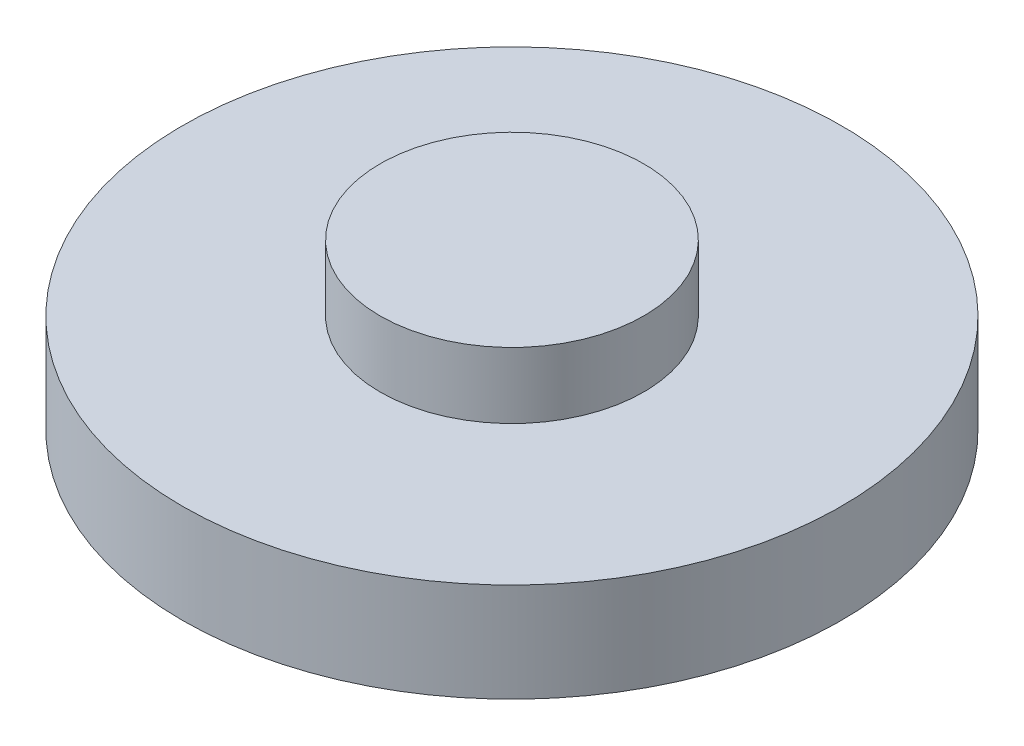
ISO-10303-21;
HEADER;
FILE_DESCRIPTION(('STEP AP214'),'2;1');
FILE_NAME('part.step','',(''),(''),'','','');
FILE_SCHEMA(('AUTOMOTIVE_DESIGN { 1 0 10303 214 1 1 1 1 }'));
ENDSEC;
DATA;
#1=APPLICATION_CONTEXT('core data for automotive mechanical design processes');
#2=APPLICATION_PROTOCOL_DEFINITION('international standard','automotive_design',2000,#1);
#3=PRODUCT_CONTEXT('',#1,'mechanical');
#4=PRODUCT('Part','Part','',(#3));
#5=PRODUCT_RELATED_PRODUCT_CATEGORY('part','',(#4));
#6=PRODUCT_DEFINITION_FORMATION('','',#4);
#7=PRODUCT_DEFINITION_CONTEXT('part definition',#1,'design');
#8=PRODUCT_DEFINITION('design','',#6,#7);
#9=PRODUCT_DEFINITION_SHAPE('','',#8);
#10=(LENGTH_UNIT() NAMED_UNIT(*) SI_UNIT(.MILLI.,.METRE.));
#11=(NAMED_UNIT(*) PLANE_ANGLE_UNIT() SI_UNIT($,.RADIAN.));
#12=(NAMED_UNIT(*) SI_UNIT($,.STERADIAN.) SOLID_ANGLE_UNIT());
#13=UNCERTAINTY_MEASURE_WITH_UNIT(LENGTH_MEASURE(1.E-05),#10,'distance_accuracy_value','');
#14=(GEOMETRIC_REPRESENTATION_CONTEXT(3) GLOBAL_UNCERTAINTY_ASSIGNED_CONTEXT((#13)) GLOBAL_UNIT_ASSIGNED_CONTEXT((#10,
#11,#12)) REPRESENTATION_CONTEXT('',''));
#15=CARTESIAN_POINT('',(0.,0.,0.));
#16=DIRECTION('',(0.,0.,1.));
#17=DIRECTION('',(1.,0.,0.));
#18=AXIS2_PLACEMENT_3D('',#15,#16,#17);
#19=CARTESIAN_POINT('',(0.,15.,0.));
#20=DIRECTION('',(0.,-1.,0.));
#21=DIRECTION('',(0.,0.,-1.));
#22=AXIS2_PLACEMENT_3D('',#19,#20,#21);
#23=CYLINDRICAL_SURFACE('',#22,50.);
#24=CARTESIAN_POINT('',(0.,15.,0.));
#25=DIRECTION('',(0.,1.,0.));
#26=DIRECTION('',(0.,0.,1.));
#27=AXIS2_PLACEMENT_3D('',#24,#25,#26);
#28=CIRCLE('',#27,50.);
#29=CARTESIAN_POINT('',(0.,15.,50.));
#30=VERTEX_POINT('',#29);
#31=EDGE_CURVE('E10',#30,#30,#28,.T.);
#32=ORIENTED_EDGE('',*,*,#31,.F.);
#33=EDGE_LOOP('',(#32));
#34=FACE_BOUND('',#33,.T.);
#35=CARTESIAN_POINT('',(0.,0.,0.));
#36=DIRECTION('',(0.,1.,0.));
#37=DIRECTION('',(0.,0.,1.));
#38=AXIS2_PLACEMENT_3D('',#35,#36,#37);
#39=CIRCLE('',#38,50.);
#40=CARTESIAN_POINT('',(0.,0.,50.));
#41=VERTEX_POINT('',#40);
#42=EDGE_CURVE('E35',#41,#41,#39,.T.);
#43=ORIENTED_EDGE('',*,*,#42,.T.);
#44=EDGE_LOOP('',(#43));
#45=FACE_BOUND('',#44,.T.);
#46=ADVANCED_FACE('F32',(#34,#45),#23,.T.);
#47=CARTESIAN_POINT('',(0.,15.,0.));
#48=DIRECTION('',(0.,1.,0.));
#49=DIRECTION('',(0.,0.,1.));
#50=AXIS2_PLACEMENT_3D('',#47,#48,#49);
#51=PLANE('',#50);
#52=CARTESIAN_POINT('',(0.,15.,0.));
#53=DIRECTION('',(0.,1.,0.));
#54=DIRECTION('',(0.,0.,1.));
#55=AXIS2_PLACEMENT_3D('',#52,#53,#54);
#56=CIRCLE('',#55,20.);
#57=CARTESIAN_POINT('',(0.,15.,20.));
#58=VERTEX_POINT('',#57);
#59=EDGE_CURVE('E44',#58,#58,#56,.T.);
#60=ORIENTED_EDGE('',*,*,#59,.F.);
#61=EDGE_LOOP('',(#60));
#62=FACE_BOUND('',#61,.T.);
#63=ORIENTED_EDGE('',*,*,#31,.T.);
#64=EDGE_LOOP('',(#63));
#65=FACE_BOUND('',#64,.T.);
#66=ADVANCED_FACE('F87',(#62,#65),#51,.T.);
#67=CARTESIAN_POINT('',(0.,0.,0.));
#68=DIRECTION('',(0.,1.,0.));
#69=DIRECTION('',(0.,0.,1.));
#70=AXIS2_PLACEMENT_3D('',#67,#68,#69);
#71=PLANE('',#70);
#72=CARTESIAN_POINT('',(-31.925,0.,-9.00000000000001));
#73=DIRECTION('',(0.,-1.,0.));
#74=DIRECTION('',(0.,0.,-1.));
#75=AXIS2_PLACEMENT_3D('',#72,#73,#74);
#76=CIRCLE('',#75,1.5);
#77=CARTESIAN_POINT('',(-31.925,0.,-10.5));
#78=VERTEX_POINT('',#77);
#79=EDGE_CURVE('E62',#78,#78,#76,.T.);
#80=ORIENTED_EDGE('',*,*,#79,.F.);
#81=EDGE_LOOP('',(#80));
#82=FACE_BOUND('',#81,.T.);
#83=CARTESIAN_POINT('',(31.93,0.,9.));
#84=DIRECTION('',(0.,-1.,0.));
#85=DIRECTION('',(0.,0.,-1.));
#86=AXIS2_PLACEMENT_3D('',#83,#84,#85);
#87=CIRCLE('',#86,1.5);
#88=CARTESIAN_POINT('',(31.93,0.,7.5));
#89=VERTEX_POINT('',#88);
#90=EDGE_CURVE('E68',#89,#89,#87,.T.);
#91=ORIENTED_EDGE('',*,*,#90,.F.);
#92=EDGE_LOOP('',(#91));
#93=FACE_BOUND('',#92,.T.);
#94=CARTESIAN_POINT('',(-31.925,0.,8.99999999999999));
#95=DIRECTION('',(0.,-1.,0.));
#96=DIRECTION('',(0.,0.,-1.));
#97=AXIS2_PLACEMENT_3D('',#94,#95,#96);
#98=CIRCLE('',#97,1.5);
#99=CARTESIAN_POINT('',(-31.925,0.,7.49999999999998));
#100=VERTEX_POINT('',#99);
#101=EDGE_CURVE('E56',#100,#100,#98,.T.);
#102=ORIENTED_EDGE('',*,*,#101,.F.);
#103=EDGE_LOOP('',(#102));
#104=FACE_BOUND('',#103,.T.);
#105=CARTESIAN_POINT('',(31.93,0.,-9.));
#106=DIRECTION('',(0.,-1.,0.));
#107=DIRECTION('',(0.,0.,-1.));
#108=AXIS2_PLACEMENT_3D('',#105,#106,#107);
#109=CIRCLE('',#108,1.5);
#110=CARTESIAN_POINT('',(31.93,0.,-10.5));
#111=VERTEX_POINT('',#110);
#112=EDGE_CURVE('E50',#111,#111,#109,.T.);
#113=ORIENTED_EDGE('',*,*,#112,.F.);
#114=EDGE_LOOP('',(#113));
#115=FACE_BOUND('',#114,.T.);
#116=ORIENTED_EDGE('',*,*,#42,.F.);
#117=EDGE_LOOP('',(#116));
#118=FACE_BOUND('',#117,.T.);
#119=ADVANCED_FACE('F83',(#82,#93,#104,#115,#118),#71,.F.);
#120=CARTESIAN_POINT('',(0.,25.,0.));
#121=DIRECTION('',(0.,-1.,0.));
#122=DIRECTION('',(0.,0.,-1.));
#123=AXIS2_PLACEMENT_3D('',#120,#121,#122);
#124=CYLINDRICAL_SURFACE('',#123,20.);
#125=CARTESIAN_POINT('',(0.,25.,0.));
#126=DIRECTION('',(0.,1.,0.));
#127=DIRECTION('',(0.,0.,1.));
#128=AXIS2_PLACEMENT_3D('',#125,#126,#127);
#129=CIRCLE('',#128,20.);
#130=CARTESIAN_POINT('',(0.,25.,20.));
#131=VERTEX_POINT('',#130);
#132=EDGE_CURVE('E42',#131,#131,#129,.T.);
#133=ORIENTED_EDGE('',*,*,#132,.F.);
#134=EDGE_LOOP('',(#133));
#135=FACE_BOUND('',#134,.T.);
#136=ORIENTED_EDGE('',*,*,#59,.T.);
#137=EDGE_LOOP('',(#136));
#138=FACE_BOUND('',#137,.T.);
#139=ADVANCED_FACE('F86',(#135,#138),#124,.T.);
#140=CARTESIAN_POINT('',(0.,25.,0.));
#141=DIRECTION('',(0.,1.,0.));
#142=DIRECTION('',(0.,0.,1.));
#143=AXIS2_PLACEMENT_3D('',#140,#141,#142);
#144=PLANE('',#143);
#145=ORIENTED_EDGE('',*,*,#132,.T.);
#146=EDGE_LOOP('',(#145));
#147=FACE_BOUND('',#146,.T.);
#148=ADVANCED_FACE('F108',(#147),#144,.T.);
#149=CARTESIAN_POINT('',(31.93,7.,-9.));
#150=DIRECTION('',(0.,-1.,0.));
#151=DIRECTION('',(0.,0.,-1.));
#152=AXIS2_PLACEMENT_3D('',#149,#150,#151);
#153=CYLINDRICAL_SURFACE('',#152,1.5);
#154=CARTESIAN_POINT('',(31.93,7.,-9.));
#155=DIRECTION('',(0.,-1.,0.));
#156=DIRECTION('',(0.,0.,-1.));
#157=AXIS2_PLACEMENT_3D('',#154,#155,#156);
#158=CIRCLE('',#157,1.5);
#159=CARTESIAN_POINT('',(31.93,7.,-10.5));
#160=VERTEX_POINT('',#159);
#161=EDGE_CURVE('E47',#160,#160,#158,.T.);
#162=ORIENTED_EDGE('',*,*,#161,.F.);
#163=EDGE_LOOP('',(#162));
#164=FACE_BOUND('',#163,.T.);
#165=ORIENTED_EDGE('',*,*,#112,.T.);
#166=EDGE_LOOP('',(#165));
#167=FACE_BOUND('',#166,.T.);
#168=ADVANCED_FACE('F112',(#164,#167),#153,.F.);
#169=CARTESIAN_POINT('',(31.93,7.,-9.));
#170=DIRECTION('',(0.,-1.,0.));
#171=DIRECTION('',(0.,0.,-1.));
#172=AXIS2_PLACEMENT_3D('',#169,#170,#171);
#173=PLANE('',#172);
#174=ORIENTED_EDGE('',*,*,#161,.T.);
#175=EDGE_LOOP('',(#174));
#176=FACE_BOUND('',#175,.T.);
#177=ADVANCED_FACE('F116',(#176),#173,.T.);
#178=CARTESIAN_POINT('',(-31.925,7.,8.99999999999999));
#179=DIRECTION('',(0.,-1.,0.));
#180=DIRECTION('',(0.,0.,-1.));
#181=AXIS2_PLACEMENT_3D('',#178,#179,#180);
#182=CYLINDRICAL_SURFACE('',#181,1.5);
#183=CARTESIAN_POINT('',(-31.925,7.,8.99999999999999));
#184=DIRECTION('',(0.,-1.,0.));
#185=DIRECTION('',(0.,0.,-1.));
#186=AXIS2_PLACEMENT_3D('',#183,#184,#185);
#187=CIRCLE('',#186,1.5);
#188=CARTESIAN_POINT('',(-31.925,7.,7.49999999999998));
#189=VERTEX_POINT('',#188);
#190=EDGE_CURVE('E53',#189,#189,#187,.T.);
#191=ORIENTED_EDGE('',*,*,#190,.F.);
#192=EDGE_LOOP('',(#191));
#193=FACE_BOUND('',#192,.T.);
#194=ORIENTED_EDGE('',*,*,#101,.T.);
#195=EDGE_LOOP('',(#194));
#196=FACE_BOUND('',#195,.T.);
#197=ADVANCED_FACE('F120',(#193,#196),#182,.F.);
#198=CARTESIAN_POINT('',(-31.925,7.,8.99999999999999));
#199=DIRECTION('',(0.,-1.,0.));
#200=DIRECTION('',(0.,0.,-1.));
#201=AXIS2_PLACEMENT_3D('',#198,#199,#200);
#202=PLANE('',#201);
#203=ORIENTED_EDGE('',*,*,#190,.T.);
#204=EDGE_LOOP('',(#203));
#205=FACE_BOUND('',#204,.T.);
#206=ADVANCED_FACE('F79',(#205),#202,.T.);
#207=CARTESIAN_POINT('',(31.93,7.,9.));
#208=DIRECTION('',(0.,-1.,0.));
#209=DIRECTION('',(0.,0.,-1.));
#210=AXIS2_PLACEMENT_3D('',#207,#208,#209);
#211=CYLINDRICAL_SURFACE('',#210,1.5);
#212=CARTESIAN_POINT('',(31.93,7.,9.));
#213=DIRECTION('',(0.,-1.,0.));
#214=DIRECTION('',(0.,0.,-1.));
#215=AXIS2_PLACEMENT_3D('',#212,#213,#214);
#216=CIRCLE('',#215,1.5);
#217=CARTESIAN_POINT('',(31.93,7.,7.5));
#218=VERTEX_POINT('',#217);
#219=EDGE_CURVE('E59',#218,#218,#216,.T.);
#220=ORIENTED_EDGE('',*,*,#219,.F.);
#221=EDGE_LOOP('',(#220));
#222=FACE_BOUND('',#221,.T.);
#223=ORIENTED_EDGE('',*,*,#90,.T.);
#224=EDGE_LOOP('',(#223));
#225=FACE_BOUND('',#224,.T.);
#226=ADVANCED_FACE('F76',(#222,#225),#211,.F.);
#227=CARTESIAN_POINT('',(31.93,7.,9.));
#228=DIRECTION('',(0.,-1.,0.));
#229=DIRECTION('',(0.,0.,-1.));
#230=AXIS2_PLACEMENT_3D('',#227,#228,#229);
#231=PLANE('',#230);
#232=ORIENTED_EDGE('',*,*,#219,.T.);
#233=EDGE_LOOP('',(#232));
#234=FACE_BOUND('',#233,.T.);
#235=ADVANCED_FACE('F74',(#234),#231,.T.);
#236=CARTESIAN_POINT('',(-31.925,7.,-9.00000000000001));
#237=DIRECTION('',(0.,-1.,0.));
#238=DIRECTION('',(0.,0.,-1.));
#239=AXIS2_PLACEMENT_3D('',#236,#237,#238);
#240=CYLINDRICAL_SURFACE('',#239,1.5);
#241=CARTESIAN_POINT('',(-31.925,7.,-9.00000000000001));
#242=DIRECTION('',(0.,-1.,0.));
#243=DIRECTION('',(0.,0.,-1.));
#244=AXIS2_PLACEMENT_3D('',#241,#242,#243);
#245=CIRCLE('',#244,1.5);
#246=CARTESIAN_POINT('',(-31.925,7.,-10.5));
#247=VERTEX_POINT('',#246);
#248=EDGE_CURVE('E65',#247,#247,#245,.T.);
#249=ORIENTED_EDGE('',*,*,#248,.F.);
#250=EDGE_LOOP('',(#249));
#251=FACE_BOUND('',#250,.T.);
#252=ORIENTED_EDGE('',*,*,#79,.T.);
#253=EDGE_LOOP('',(#252));
#254=FACE_BOUND('',#253,.T.);
#255=ADVANCED_FACE('F128',(#251,#254),#240,.F.);
#256=CARTESIAN_POINT('',(-31.925,7.,-9.00000000000001));
#257=DIRECTION('',(0.,-1.,0.));
#258=DIRECTION('',(0.,0.,-1.));
#259=AXIS2_PLACEMENT_3D('',#256,#257,#258);
#260=PLANE('',#259);
#261=ORIENTED_EDGE('',*,*,#248,.T.);
#262=EDGE_LOOP('',(#261));
#263=FACE_BOUND('',#262,.T.);
#264=ADVANCED_FACE('F131',(#263),#260,.T.);
#265=CLOSED_SHELL('',(#46,#66,#119,#139,#148,#168,#177,#197,#206,#226,#235,#255,#264));
#266=MANIFOLD_SOLID_BREP('B2',#265);
#267=ADVANCED_BREP_SHAPE_REPRESENTATION('',(#18,#266),#14);
#268=SHAPE_DEFINITION_REPRESENTATION(#9,#267);
ENDSEC;
END-ISO-10303-21;
